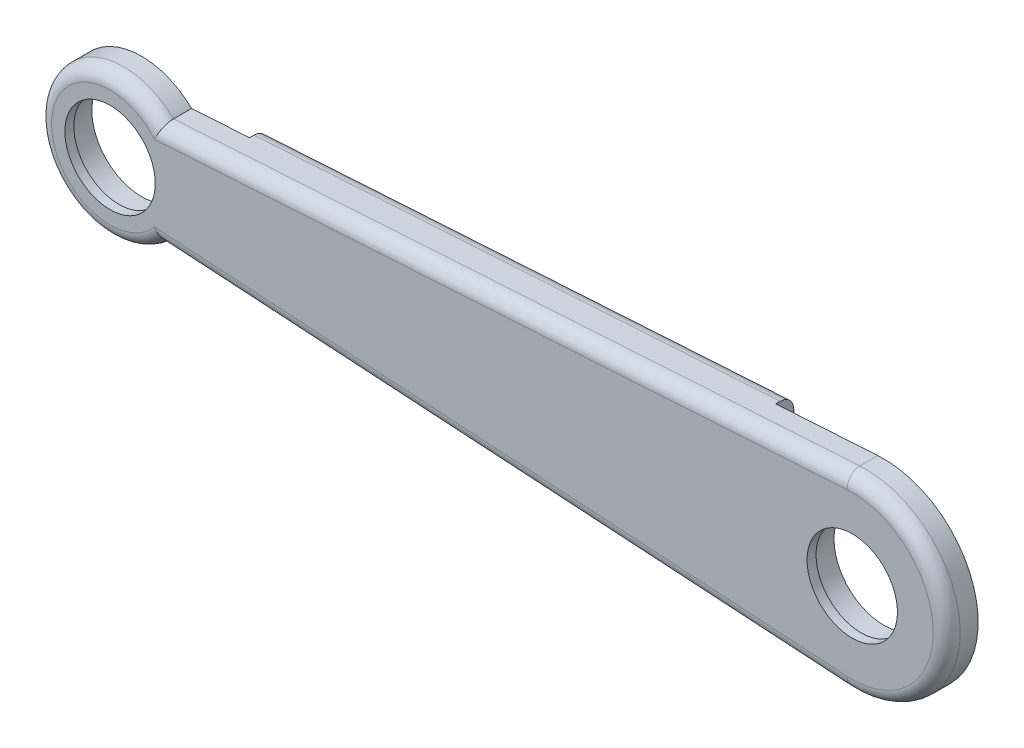
ISO-10303-21;
HEADER;
FILE_DESCRIPTION(('STEP AP214'),'2;1');
FILE_NAME('part.step','',(''),(''),'','','');
FILE_SCHEMA(('AUTOMOTIVE_DESIGN { 1 0 10303 214 1 1 1 1 }'));
ENDSEC;
DATA;
#1=APPLICATION_CONTEXT('core data for automotive mechanical design processes');
#2=APPLICATION_PROTOCOL_DEFINITION('international standard','automotive_design',2000,#1);
#3=PRODUCT_CONTEXT('',#1,'mechanical');
#4=PRODUCT('Part','Part','',(#3));
#5=PRODUCT_RELATED_PRODUCT_CATEGORY('part','',(#4));
#6=PRODUCT_DEFINITION_FORMATION('','',#4);
#7=PRODUCT_DEFINITION_CONTEXT('part definition',#1,'design');
#8=PRODUCT_DEFINITION('design','',#6,#7);
#9=PRODUCT_DEFINITION_SHAPE('','',#8);
#10=(LENGTH_UNIT() NAMED_UNIT(*) SI_UNIT(.MILLI.,.METRE.));
#11=(NAMED_UNIT(*) PLANE_ANGLE_UNIT() SI_UNIT($,.RADIAN.));
#12=(NAMED_UNIT(*) SI_UNIT($,.STERADIAN.) SOLID_ANGLE_UNIT());
#13=UNCERTAINTY_MEASURE_WITH_UNIT(LENGTH_MEASURE(1.E-05),#10,'distance_accuracy_value','');
#14=(GEOMETRIC_REPRESENTATION_CONTEXT(3) GLOBAL_UNCERTAINTY_ASSIGNED_CONTEXT((#13)) GLOBAL_UNIT_ASSIGNED_CONTEXT((#10,
#11,#12)) REPRESENTATION_CONTEXT('',''));
#15=CARTESIAN_POINT('',(0.,0.,0.));
#16=DIRECTION('',(0.,0.,1.));
#17=DIRECTION('',(1.,0.,0.));
#18=AXIS2_PLACEMENT_3D('',#15,#16,#17);
#19=CARTESIAN_POINT('',(24.,-21.01,4.));
#20=DIRECTION('',(1.,0.,0.));
#21=DIRECTION('',(0.,0.,-1.));
#22=AXIS2_PLACEMENT_3D('',#19,#20,#21);
#23=PLANE('',#22);
#24=DIRECTION('',(0.,1.,0.));
#25=VECTOR('',#24,1.);
#26=CARTESIAN_POINT('',(24.,-21.01,4.));
#27=LINE('',#26,#25);
#28=CARTESIAN_POINT('',(24.,-12.2982960509077,4.));
#29=VERTEX_POINT('',#28);
#30=CARTESIAN_POINT('',(24.,12.2982960509077,4.));
#31=VERTEX_POINT('',#30);
#32=EDGE_CURVE('E12',#29,#31,#27,.T.);
#33=ORIENTED_EDGE('',*,*,#32,.T.);
#34=DIRECTION('',(0.,0.,-1.));
#35=VECTOR('',#34,1.);
#36=CARTESIAN_POINT('',(24.,12.2982960509077,11.));
#37=LINE('',#36,#35);
#38=CARTESIAN_POINT('',(24.,12.2982960509077,3.));
#39=VERTEX_POINT('',#38);
#40=EDGE_CURVE('E397',#31,#39,#37,.T.);
#41=ORIENTED_EDGE('',*,*,#40,.T.);
#42=CARTESIAN_POINT('',(24.,9.29253554521665,3.));
#43=DIRECTION('',(1.,0.,0.));
#44=DIRECTION('',(0.,-1.,0.));
#45=AXIS2_PLACEMENT_3D('',#42,#43,#44);
#46=ELLIPSE('',#45,3.00576050569108,3.);
#47=CARTESIAN_POINT('',(24.,9.29253554521665,0.));
#48=VERTEX_POINT('',#47);
#49=EDGE_CURVE('E66',#39,#48,#46,.F.);
#50=ORIENTED_EDGE('',*,*,#49,.T.);
#51=DIRECTION('',(0.,1.,0.));
#52=VECTOR('',#51,1.);
#53=CARTESIAN_POINT('',(24.,0.,0.));
#54=LINE('',#53,#52);
#55=CARTESIAN_POINT('',(24.,-9.29253554521665,0.));
#56=VERTEX_POINT('',#55);
#57=EDGE_CURVE('E62',#56,#48,#54,.T.);
#58=ORIENTED_EDGE('',*,*,#57,.F.);
#59=CARTESIAN_POINT('',(24.,-9.29253554521665,3.));
#60=DIRECTION('',(1.,0.,0.));
#61=DIRECTION('',(0.,-1.,0.));
#62=AXIS2_PLACEMENT_3D('',#59,#60,#61);
#63=ELLIPSE('',#62,3.00576050569108,3.);
#64=CARTESIAN_POINT('',(24.,-12.2982960509077,3.));
#65=VERTEX_POINT('',#64);
#66=EDGE_CURVE('E405',#56,#65,#63,.F.);
#67=ORIENTED_EDGE('',*,*,#66,.T.);
#68=DIRECTION('',(0.,0.,-1.));
#69=VECTOR('',#68,1.);
#70=CARTESIAN_POINT('',(24.,-12.2982960509077,11.));
#71=LINE('',#70,#69);
#72=EDGE_CURVE('E48',#29,#65,#71,.T.);
#73=ORIENTED_EDGE('',*,*,#72,.F.);
#74=EDGE_LOOP('',(#33,#41,#50,#58,#67,#73));
#75=FACE_BOUND('',#74,.T.);
#76=ADVANCED_FACE('F42',(#75),#23,.F.);
#77=CARTESIAN_POINT('',(-20.0212028963718,-21.01,4.));
#78=DIRECTION('',(0.,0.,1.));
#79=DIRECTION('',(1.,0.,0.));
#80=AXIS2_PLACEMENT_3D('',#77,#78,#79);
#81=PLANE('',#80);
#82=CARTESIAN_POINT('',(0.,0.,4.));
#83=DIRECTION('',(0.,0.,1.));
#84=DIRECTION('',(1.,0.,0.));
#85=AXIS2_PLACEMENT_3D('',#82,#83,#84);
#86=CIRCLE('',#85,11.05);
#87=CARTESIAN_POINT('',(11.05,0.,4.));
#88=VERTEX_POINT('',#87);
#89=EDGE_CURVE('E402',#88,#88,#86,.T.);
#90=ORIENTED_EDGE('',*,*,#89,.T.);
#91=EDGE_LOOP('',(#90));
#92=FACE_BOUND('',#91,.T.);
#93=CARTESIAN_POINT('',(16.,0.,4.));
#94=DIRECTION('',(0.,0.,1.));
#95=DIRECTION('',(1.,0.,0.));
#96=AXIS2_PLACEMENT_3D('',#93,#94,#95);
#97=CIRCLE('',#96,2.2);
#98=CARTESIAN_POINT('',(18.2,0.,4.));
#99=VERTEX_POINT('',#98);
#100=EDGE_CURVE('E52',#99,#99,#97,.T.);
#101=ORIENTED_EDGE('',*,*,#100,.T.);
#102=EDGE_LOOP('',(#101));
#103=FACE_BOUND('',#102,.T.);
#104=CARTESIAN_POINT('',(0.,0.,4.));
#105=DIRECTION('',(0.,0.,1.));
#106=DIRECTION('',(1.,0.,0.));
#107=AXIS2_PLACEMENT_3D('',#104,#105,#106);
#108=CIRCLE('',#107,16.);
#109=CARTESIAN_POINT('',(11.1242977306435,11.5,4.));
#110=VERTEX_POINT('',#109);
#111=CARTESIAN_POINT('',(11.1242977306435,-11.5,4.));
#112=VERTEX_POINT('',#111);
#113=EDGE_CURVE('E413',#110,#112,#108,.T.);
#114=ORIENTED_EDGE('',*,*,#113,.F.);
#115=DIRECTION('',(0.998083511417436,0.0618813722911973,0.));
#116=VECTOR('',#115,1.);
#117=CARTESIAN_POINT('',(11.1242977306435,11.5,4.));
#118=LINE('',#117,#116);
#119=EDGE_CURVE('E384',#110,#31,#118,.T.);
#120=ORIENTED_EDGE('',*,*,#119,.T.);
#121=ORIENTED_EDGE('',*,*,#32,.F.);
#122=DIRECTION('',(0.998083511417436,-0.0618813722911973,0.));
#123=VECTOR('',#122,1.);
#124=CARTESIAN_POINT('',(11.1242977306435,-11.5,4.));
#125=LINE('',#124,#123);
#126=EDGE_CURVE('E420',#112,#29,#125,.T.);
#127=ORIENTED_EDGE('',*,*,#126,.F.);
#128=EDGE_LOOP('',(#114,#120,#121,#127));
#129=FACE_BOUND('',#128,.T.);
#130=ADVANCED_FACE('F353',(#92,#103,#129),#81,.F.);
#131=CARTESIAN_POINT('',(196.908753761415,-21.01,4.));
#132=DIRECTION('',(0.,0.,-1.));
#133=DIRECTION('',(-1.,0.,0.));
#134=AXIS2_PLACEMENT_3D('',#131,#132,#133);
#135=PLANE('',#134);
#136=CARTESIAN_POINT('',(165.,0.,4.));
#137=DIRECTION('',(0.,0.,-1.));
#138=DIRECTION('',(-1.,0.,0.));
#139=AXIS2_PLACEMENT_3D('',#136,#137,#138);
#140=CIRCLE('',#139,21.);
#141=CARTESIAN_POINT('',(163.700491181885,-20.9597537397661,4.00000000000001));
#142=VERTEX_POINT('',#141);
#143=CARTESIAN_POINT('',(163.700491181885,20.9597537397661,4.00000000000001));
#144=VERTEX_POINT('',#143);
#145=EDGE_CURVE('E390',#142,#144,#140,.F.);
#146=ORIENTED_EDGE('',*,*,#145,.F.);
#147=DIRECTION('',(-0.998083511417436,0.0618813722911973,0.));
#148=VECTOR('',#147,1.);
#149=CARTESIAN_POINT('',(11.1242977306435,-11.5,4.00000000000002));
#150=LINE('',#149,#148);
#151=CARTESIAN_POINT('',(141.,-19.5523188608708,4.00000000000001));
#152=VERTEX_POINT('',#151);
#153=EDGE_CURVE('E385',#142,#152,#150,.T.);
#154=ORIENTED_EDGE('',*,*,#153,.T.);
#155=DIRECTION('',(0.,1.,0.));
#156=VECTOR('',#155,1.);
#157=CARTESIAN_POINT('',(141.,-21.01,4.00000000000001));
#158=LINE('',#157,#156);
#159=CARTESIAN_POINT('',(141.,19.5523188608708,4.00000000000001));
#160=VERTEX_POINT('',#159);
#161=EDGE_CURVE('E369',#152,#160,#158,.T.);
#162=ORIENTED_EDGE('',*,*,#161,.T.);
#163=DIRECTION('',(-0.998083511417436,-0.0618813722911973,0.));
#164=VECTOR('',#163,1.);
#165=CARTESIAN_POINT('',(11.1242977306435,11.5,4.00000000000002));
#166=LINE('',#165,#164);
#167=EDGE_CURVE('E400',#144,#160,#166,.T.);
#168=ORIENTED_EDGE('',*,*,#167,.F.);
#169=EDGE_LOOP('',(#146,#154,#162,#168));
#170=FACE_BOUND('',#169,.T.);
#171=CARTESIAN_POINT('',(165.,0.,4.));
#172=DIRECTION('',(0.,0.,-1.));
#173=DIRECTION('',(-1.,0.,0.));
#174=AXIS2_PLACEMENT_3D('',#171,#172,#173);
#175=CIRCLE('',#174,11.05);
#176=CARTESIAN_POINT('',(153.95,0.,4.00000000000001));
#177=VERTEX_POINT('',#176);
#178=EDGE_CURVE('E401',#177,#177,#175,.F.);
#179=ORIENTED_EDGE('',*,*,#178,.T.);
#180=EDGE_LOOP('',(#179));
#181=FACE_BOUND('',#180,.T.);
#182=CARTESIAN_POINT('',(149.,0.,4.));
#183=DIRECTION('',(0.,0.,-1.));
#184=DIRECTION('',(-1.,0.,0.));
#185=AXIS2_PLACEMENT_3D('',#182,#183,#184);
#186=CIRCLE('',#185,2.19999999999998);
#187=CARTESIAN_POINT('',(146.8,0.,4.));
#188=VERTEX_POINT('',#187);
#189=EDGE_CURVE('E533',#188,#188,#186,.T.);
#190=ORIENTED_EDGE('',*,*,#189,.F.);
#191=EDGE_LOOP('',(#190));
#192=FACE_BOUND('',#191,.T.);
#193=ADVANCED_FACE('F46',(#170,#181,#192),#135,.T.);
#194=CARTESIAN_POINT('',(141.,-21.01,4.00000000000001));
#195=DIRECTION('',(1.,0.,0.));
#196=DIRECTION('',(0.,0.,-1.));
#197=AXIS2_PLACEMENT_3D('',#194,#195,#196);
#198=PLANE('',#197);
#199=ORIENTED_EDGE('',*,*,#161,.F.);
#200=DIRECTION('',(0.,0.,-1.));
#201=VECTOR('',#200,1.);
#202=CARTESIAN_POINT('',(141.,-19.5523188608708,11.));
#203=LINE('',#202,#201);
#204=CARTESIAN_POINT('',(141.,-19.5523188608708,3.));
#205=VERTEX_POINT('',#204);
#206=EDGE_CURVE('E375',#152,#205,#203,.T.);
#207=ORIENTED_EDGE('',*,*,#206,.T.);
#208=CARTESIAN_POINT('',(141.,-16.5465583551797,3.));
#209=DIRECTION('',(1.,0.,0.));
#210=DIRECTION('',(0.,-1.,0.));
#211=AXIS2_PLACEMENT_3D('',#208,#209,#210);
#212=ELLIPSE('',#211,3.00576050569108,3.);
#213=CARTESIAN_POINT('',(141.,-16.5465583551797,0.));
#214=VERTEX_POINT('',#213);
#215=EDGE_CURVE('E396',#214,#205,#212,.F.);
#216=ORIENTED_EDGE('',*,*,#215,.F.);
#217=DIRECTION('',(0.,1.,0.));
#218=VECTOR('',#217,1.);
#219=CARTESIAN_POINT('',(141.,0.,0.));
#220=LINE('',#219,#218);
#221=CARTESIAN_POINT('',(141.,16.5465583551797,0.));
#222=VERTEX_POINT('',#221);
#223=EDGE_CURVE('E386',#214,#222,#220,.T.);
#224=ORIENTED_EDGE('',*,*,#223,.T.);
#225=CARTESIAN_POINT('',(141.,16.5465583551797,3.));
#226=DIRECTION('',(1.,0.,0.));
#227=DIRECTION('',(0.,-1.,0.));
#228=AXIS2_PLACEMENT_3D('',#225,#226,#227);
#229=ELLIPSE('',#228,3.00576050569108,3.);
#230=CARTESIAN_POINT('',(141.,19.5523188608708,3.));
#231=VERTEX_POINT('',#230);
#232=EDGE_CURVE('E290',#231,#222,#229,.F.);
#233=ORIENTED_EDGE('',*,*,#232,.F.);
#234=DIRECTION('',(0.,0.,-1.));
#235=VECTOR('',#234,1.);
#236=CARTESIAN_POINT('',(141.,19.5523188608708,11.));
#237=LINE('',#236,#235);
#238=EDGE_CURVE('E371',#160,#231,#237,.T.);
#239=ORIENTED_EDGE('',*,*,#238,.F.);
#240=EDGE_LOOP('',(#199,#207,#216,#224,#233,#239));
#241=FACE_BOUND('',#240,.T.);
#242=ADVANCED_FACE('F326',(#241),#198,.T.);
#243=CARTESIAN_POINT('',(149.,0.,10.));
#244=DIRECTION('',(0.,0.,-1.));
#245=DIRECTION('',(-1.,0.,0.));
#246=AXIS2_PLACEMENT_3D('',#243,#244,#245);
#247=PLANE('',#246);
#248=CARTESIAN_POINT('',(149.,0.,10.));
#249=DIRECTION('',(0.,0.,-1.));
#250=DIRECTION('',(-1.,0.,0.));
#251=AXIS2_PLACEMENT_3D('',#248,#249,#250);
#252=CIRCLE('',#251,2.19999999999998);
#253=CARTESIAN_POINT('',(146.8,0.,10.));
#254=VERTEX_POINT('',#253);
#255=EDGE_CURVE('E203',#254,#254,#252,.T.);
#256=ORIENTED_EDGE('',*,*,#255,.T.);
#257=EDGE_LOOP('',(#256));
#258=FACE_BOUND('',#257,.T.);
#259=ADVANCED_FACE('F356',(#258),#247,.T.);
#260=CARTESIAN_POINT('',(149.,0.,10.));
#261=DIRECTION('',(0.,0.,-1.));
#262=DIRECTION('',(-1.,0.,0.));
#263=AXIS2_PLACEMENT_3D('',#260,#261,#262);
#264=CYLINDRICAL_SURFACE('',#263,2.19999999999998);
#265=ORIENTED_EDGE('',*,*,#255,.F.);
#266=EDGE_LOOP('',(#265));
#267=FACE_BOUND('',#266,.T.);
#268=ORIENTED_EDGE('',*,*,#189,.T.);
#269=EDGE_LOOP('',(#268));
#270=FACE_BOUND('',#269,.T.);
#271=ADVANCED_FACE('F363',(#267,#270),#264,.F.);
#272=CARTESIAN_POINT('',(0.,0.,0.));
#273=DIRECTION('',(0.,0.,1.));
#274=DIRECTION('',(1.,0.,0.));
#275=AXIS2_PLACEMENT_3D('',#272,#273,#274);
#276=PLANE('',#275);
#277=ORIENTED_EDGE('',*,*,#223,.F.);
#278=DIRECTION('',(0.998083511417436,-0.0618813722911973,0.));
#279=VECTOR('',#278,1.);
#280=CARTESIAN_POINT('',(-0.48202950219566,-7.77464494313874,0.));
#281=LINE('',#280,#279);
#282=CARTESIAN_POINT('',(122.608915679571,-15.4063075418434,0.));
#283=VERTEX_POINT('',#282);
#284=EDGE_CURVE('E273',#214,#283,#281,.F.);
#285=ORIENTED_EDGE('',*,*,#284,.T.);
#286=CARTESIAN_POINT('',(123.564109750732,0.,0.));
#287=DIRECTION('',(0.,0.,1.));
#288=DIRECTION('',(1.,0.,0.));
#289=AXIS2_PLACEMENT_3D('',#286,#287,#288);
#290=CIRCLE('',#289,15.4358902492679);
#291=CARTESIAN_POINT('',(122.608915679571,15.4063075418434,0.));
#292=VERTEX_POINT('',#291);
#293=EDGE_CURVE('E277',#283,#292,#290,.T.);
#294=ORIENTED_EDGE('',*,*,#293,.T.);
#295=DIRECTION('',(0.998083511417436,0.0618813722911973,0.));
#296=VECTOR('',#295,1.);
#297=CARTESIAN_POINT('',(163.886135298759,17.9655032055138,0.));
#298=LINE('',#297,#296);
#299=EDGE_CURVE('E274',#292,#222,#298,.T.);
#300=ORIENTED_EDGE('',*,*,#299,.T.);
#301=EDGE_LOOP('',(#277,#285,#294,#300));
#302=FACE_BOUND('',#301,.T.);
#303=ADVANCED_FACE('F435',(#302),#276,.F.);
#304=CARTESIAN_POINT('',(11.1242977306435,-11.5,11.));
#305=DIRECTION('',(0.0618813722911973,0.998083511417436,0.));
#306=DIRECTION('',(-0.998083511417436,0.0618813722911973,0.));
#307=AXIS2_PLACEMENT_3D('',#304,#305,#306);
#308=PLANE('',#307);
#309=DIRECTION('',(0.,0.,-1.));
#310=VECTOR('',#309,1.);
#311=CARTESIAN_POINT('',(11.1242977306435,-11.5,11.));
#312=LINE('',#311,#310);
#313=CARTESIAN_POINT('',(11.1242977306435,-11.5,8.));
#314=VERTEX_POINT('',#313);
#315=EDGE_CURVE('E240',#314,#112,#312,.T.);
#316=ORIENTED_EDGE('',*,*,#315,.T.);
#317=ORIENTED_EDGE('',*,*,#126,.T.);
#318=ORIENTED_EDGE('',*,*,#72,.T.);
#319=DIRECTION('',(0.998083511417436,-0.0618813722911973,0.));
#320=VECTOR('',#319,1.);
#321=CARTESIAN_POINT('',(11.1242977306435,-11.5,3.));
#322=LINE('',#321,#320);
#323=EDGE_CURVE('E251',#65,#205,#322,.T.);
#324=ORIENTED_EDGE('',*,*,#323,.T.);
#325=ORIENTED_EDGE('',*,*,#206,.F.);
#326=ORIENTED_EDGE('',*,*,#153,.F.);
#327=DIRECTION('',(0.,0.,-1.));
#328=VECTOR('',#327,1.);
#329=CARTESIAN_POINT('',(163.700491181885,-20.9597537397661,11.));
#330=LINE('',#329,#328);
#331=CARTESIAN_POINT('',(163.700491181885,-20.9597537397661,8.));
#332=VERTEX_POINT('',#331);
#333=EDGE_CURVE('E233',#332,#142,#330,.T.);
#334=ORIENTED_EDGE('',*,*,#333,.F.);
#335=DIRECTION('',(0.998083511417436,-0.0618813722911973,0.));
#336=VECTOR('',#335,1.);
#337=CARTESIAN_POINT('',(11.1242977306435,-11.5,8.));
#338=LINE('',#337,#336);
#339=EDGE_CURVE('E257',#332,#314,#338,.F.);
#340=ORIENTED_EDGE('',*,*,#339,.T.);
#341=EDGE_LOOP('',(#316,#317,#318,#324,#325,#326,#334,#340));
#342=FACE_BOUND('',#341,.T.);
#343=ADVANCED_FACE('F378',(#342),#308,.F.);
#344=CARTESIAN_POINT('',(165.,0.,11.));
#345=DIRECTION('',(0.,0.,-1.));
#346=DIRECTION('',(-1.,0.,0.));
#347=AXIS2_PLACEMENT_3D('',#344,#345,#346);
#348=CYLINDRICAL_SURFACE('',#347,21.);
#349=ORIENTED_EDGE('',*,*,#145,.T.);
#350=DIRECTION('',(0.,0.,-1.));
#351=VECTOR('',#350,1.);
#352=CARTESIAN_POINT('',(163.700491181885,20.9597537397661,11.));
#353=LINE('',#352,#351);
#354=CARTESIAN_POINT('',(163.700491181885,20.9597537397661,8.));
#355=VERTEX_POINT('',#354);
#356=EDGE_CURVE('E231',#355,#144,#353,.T.);
#357=ORIENTED_EDGE('',*,*,#356,.F.);
#358=CARTESIAN_POINT('',(165.,0.,8.));
#359=DIRECTION('',(0.,0.,1.));
#360=DIRECTION('',(1.,0.,0.));
#361=AXIS2_PLACEMENT_3D('',#358,#359,#360);
#362=CIRCLE('',#361,21.);
#363=EDGE_CURVE('E260',#355,#332,#362,.F.);
#364=ORIENTED_EDGE('',*,*,#363,.T.);
#365=ORIENTED_EDGE('',*,*,#333,.T.);
#366=EDGE_LOOP('',(#349,#357,#364,#365));
#367=FACE_BOUND('',#366,.T.);
#368=ADVANCED_FACE('F473',(#367),#348,.T.);
#369=CARTESIAN_POINT('',(11.1242977306435,11.5,11.));
#370=DIRECTION('',(-0.0618813722911973,0.998083511417436,0.));
#371=DIRECTION('',(-0.998083511417436,-0.0618813722911973,0.));
#372=AXIS2_PLACEMENT_3D('',#369,#370,#371);
#373=PLANE('',#372);
#374=ORIENTED_EDGE('',*,*,#119,.F.);
#375=DIRECTION('',(0.,0.,-1.));
#376=VECTOR('',#375,1.);
#377=CARTESIAN_POINT('',(11.1242977306435,11.5,11.));
#378=LINE('',#377,#376);
#379=CARTESIAN_POINT('',(11.1242977306435,11.5,8.));
#380=VERTEX_POINT('',#379);
#381=EDGE_CURVE('E224',#380,#110,#378,.T.);
#382=ORIENTED_EDGE('',*,*,#381,.F.);
#383=DIRECTION('',(0.998083511417436,0.0618813722911973,0.));
#384=VECTOR('',#383,1.);
#385=CARTESIAN_POINT('',(11.1242977306435,11.5,8.));
#386=LINE('',#385,#384);
#387=EDGE_CURVE('E264',#380,#355,#386,.T.);
#388=ORIENTED_EDGE('',*,*,#387,.T.);
#389=ORIENTED_EDGE('',*,*,#356,.T.);
#390=ORIENTED_EDGE('',*,*,#167,.T.);
#391=ORIENTED_EDGE('',*,*,#238,.T.);
#392=DIRECTION('',(0.998083511417436,0.0618813722911973,0.));
#393=VECTOR('',#392,1.);
#394=CARTESIAN_POINT('',(11.1242977306435,11.5,3.));
#395=LINE('',#394,#393);
#396=EDGE_CURVE('E263',#231,#39,#395,.F.);
#397=ORIENTED_EDGE('',*,*,#396,.T.);
#398=ORIENTED_EDGE('',*,*,#40,.F.);
#399=EDGE_LOOP('',(#374,#382,#388,#389,#390,#391,#397,#398));
#400=FACE_BOUND('',#399,.T.);
#401=ADVANCED_FACE('F427',(#400),#373,.T.);
#402=CARTESIAN_POINT('',(165.,0.,42.2541197284454));
#403=DIRECTION('',(0.,0.,-1.));
#404=DIRECTION('',(-1.,0.,0.));
#405=AXIS2_PLACEMENT_3D('',#402,#403,#404);
#406=CYLINDRICAL_SURFACE('',#405,11.05);
#407=CARTESIAN_POINT('',(165.,0.,9.));
#408=DIRECTION('',(0.,0.,1.));
#409=DIRECTION('',(1.,0.,0.));
#410=AXIS2_PLACEMENT_3D('',#407,#408,#409);
#411=CIRCLE('',#410,11.05);
#412=CARTESIAN_POINT('',(176.05,0.,9.));
#413=VERTEX_POINT('',#412);
#414=EDGE_CURVE('E226',#413,#413,#411,.F.);
#415=ORIENTED_EDGE('',*,*,#414,.F.);
#416=EDGE_LOOP('',(#415));
#417=FACE_BOUND('',#416,.T.);
#418=ORIENTED_EDGE('',*,*,#178,.F.);
#419=EDGE_LOOP('',(#418));
#420=FACE_BOUND('',#419,.T.);
#421=ADVANCED_FACE('F347',(#417,#420),#406,.F.);
#422=CARTESIAN_POINT('',(11.3099418475171,-8.50574946574769,3.));
#423=DIRECTION('',(0.998083511417436,-0.0618813722911973,0.));
#424=DIRECTION('',(0.0618813722911973,0.998083511417436,0.));
#425=AXIS2_PLACEMENT_3D('',#422,#423,#424);
#426=CYLINDRICAL_SURFACE('',#425,3.);
#427=ORIENTED_EDGE('',*,*,#66,.F.);
#428=DIRECTION('',(0.998083511417436,-0.0618813722911973,0.));
#429=VECTOR('',#428,1.);
#430=CARTESIAN_POINT('',(-0.48202950219566,-7.77464494313874,0.));
#431=LINE('',#430,#429);
#432=CARTESIAN_POINT('',(35.3984892515236,-9.99924410102581,0.));
#433=VERTEX_POINT('',#432);
#434=EDGE_CURVE('E266',#433,#56,#431,.F.);
#435=ORIENTED_EDGE('',*,*,#434,.F.);
#436=DIRECTION('',(0.998083511417436,-0.0618813722911973,0.));
#437=VECTOR('',#436,1.);
#438=CARTESIAN_POINT('',(-0.48202950219566,-7.77464494313874,0.));
#439=LINE('',#438,#437);
#440=EDGE_CURVE('E448',#283,#433,#439,.F.);
#441=ORIENTED_EDGE('',*,*,#440,.F.);
#442=ORIENTED_EDGE('',*,*,#284,.F.);
#443=ORIENTED_EDGE('',*,*,#215,.T.);
#444=ORIENTED_EDGE('',*,*,#323,.F.);
#445=EDGE_LOOP('',(#427,#435,#441,#442,#443,#444));
#446=FACE_BOUND('',#445,.T.);
#447=ADVANCED_FACE('F341',(#446),#426,.T.);
#448=CARTESIAN_POINT('',(-0.48202950219566,7.77464494313875,3.));
#449=DIRECTION('',(-0.998083511417436,-0.0618813722911973,0.));
#450=DIRECTION('',(0.0618813722911973,-0.998083511417436,0.));
#451=AXIS2_PLACEMENT_3D('',#448,#449,#450);
#452=CYLINDRICAL_SURFACE('',#451,3.);
#453=ORIENTED_EDGE('',*,*,#49,.F.);
#454=ORIENTED_EDGE('',*,*,#396,.F.);
#455=ORIENTED_EDGE('',*,*,#232,.T.);
#456=ORIENTED_EDGE('',*,*,#299,.F.);
#457=DIRECTION('',(0.998083511417436,0.0618813722911973,0.));
#458=VECTOR('',#457,1.);
#459=CARTESIAN_POINT('',(163.886135298759,17.9655032055138,0.));
#460=LINE('',#459,#458);
#461=CARTESIAN_POINT('',(35.3984892515236,9.99924410102581,0.));
#462=VERTEX_POINT('',#461);
#463=EDGE_CURVE('E442',#462,#292,#460,.T.);
#464=ORIENTED_EDGE('',*,*,#463,.F.);
#465=DIRECTION('',(0.998083511417436,0.0618813722911973,0.));
#466=VECTOR('',#465,1.);
#467=CARTESIAN_POINT('',(163.886135298759,17.9655032055138,0.));
#468=LINE('',#467,#466);
#469=EDGE_CURVE('E271',#48,#462,#468,.T.);
#470=ORIENTED_EDGE('',*,*,#469,.F.);
#471=EDGE_LOOP('',(#453,#454,#455,#456,#464,#470));
#472=FACE_BOUND('',#471,.T.);
#473=ADVANCED_FACE('F338',(#472),#452,.T.);
#474=ORIENTED_EDGE('',*,*,#434,.T.);
#475=ORIENTED_EDGE('',*,*,#57,.T.);
#476=ORIENTED_EDGE('',*,*,#469,.T.);
#477=CARTESIAN_POINT('',(36.0184443352093,0.,0.));
#478=DIRECTION('',(0.,0.,1.));
#479=DIRECTION('',(1.,0.,0.));
#480=AXIS2_PLACEMENT_3D('',#477,#478,#479);
#481=CIRCLE('',#480,10.0184443352093);
#482=EDGE_CURVE('E268',#462,#433,#481,.T.);
#483=ORIENTED_EDGE('',*,*,#482,.T.);
#484=EDGE_LOOP('',(#474,#475,#476,#483));
#485=FACE_BOUND('',#484,.T.);
#486=ADVANCED_FACE('F345',(#485),#276,.F.);
#487=CARTESIAN_POINT('',(0.,0.,11.));
#488=DIRECTION('',(0.,0.,1.));
#489=DIRECTION('',(1.,0.,0.));
#490=AXIS2_PLACEMENT_3D('',#487,#488,#489);
#491=PLANE('',#490);
#492=DIRECTION('',(0.998083511417436,0.0618813722911973,0.));
#493=VECTOR('',#492,1.);
#494=CARTESIAN_POINT('',(-0.48202950219566,7.77464494313874,11.));
#495=LINE('',#494,#493);
#496=CARTESIAN_POINT('',(163.886135298758,17.9655032055138,11.));
#497=VERTEX_POINT('',#496);
#498=CARTESIAN_POINT('',(9.90583570640879,8.41869461125873,11.));
#499=VERTEX_POINT('',#498);
#500=EDGE_CURVE('E238',#497,#499,#495,.F.);
#501=ORIENTED_EDGE('',*,*,#500,.T.);
#502=CARTESIAN_POINT('',(0.,0.,11.));
#503=DIRECTION('',(0.,0.,1.));
#504=DIRECTION('',(1.,0.,0.));
#505=AXIS2_PLACEMENT_3D('',#502,#503,#504);
#506=CIRCLE('',#505,13.);
#507=CARTESIAN_POINT('',(9.90583570640879,-8.41869461125873,11.));
#508=VERTEX_POINT('',#507);
#509=EDGE_CURVE('E246',#499,#508,#506,.T.);
#510=ORIENTED_EDGE('',*,*,#509,.T.);
#511=DIRECTION('',(0.998083511417436,-0.0618813722911973,0.));
#512=VECTOR('',#511,1.);
#513=CARTESIAN_POINT('',(163.886135298759,-17.9655032055138,11.));
#514=LINE('',#513,#512);
#515=CARTESIAN_POINT('',(163.886135298758,-17.9655032055138,11.));
#516=VERTEX_POINT('',#515);
#517=EDGE_CURVE('E247',#508,#516,#514,.T.);
#518=ORIENTED_EDGE('',*,*,#517,.T.);
#519=CARTESIAN_POINT('',(165.,0.,11.));
#520=DIRECTION('',(0.,0.,1.));
#521=DIRECTION('',(1.,0.,0.));
#522=AXIS2_PLACEMENT_3D('',#519,#520,#521);
#523=CIRCLE('',#522,18.);
#524=EDGE_CURVE('E241',#516,#497,#523,.T.);
#525=ORIENTED_EDGE('',*,*,#524,.T.);
#526=EDGE_LOOP('',(#501,#510,#518,#525));
#527=FACE_BOUND('',#526,.T.);
#528=CARTESIAN_POINT('',(0.,0.,11.));
#529=DIRECTION('',(0.,0.,1.));
#530=DIRECTION('',(1.,0.,0.));
#531=AXIS2_PLACEMENT_3D('',#528,#529,#530);
#532=CIRCLE('',#531,10.05);
#533=CARTESIAN_POINT('',(10.05,0.,11.));
#534=VERTEX_POINT('',#533);
#535=EDGE_CURVE('E199',#534,#534,#532,.T.);
#536=ORIENTED_EDGE('',*,*,#535,.F.);
#537=EDGE_LOOP('',(#536));
#538=FACE_BOUND('',#537,.T.);
#539=CARTESIAN_POINT('',(165.,0.,11.));
#540=DIRECTION('',(0.,0.,-1.));
#541=DIRECTION('',(-1.,0.,0.));
#542=AXIS2_PLACEMENT_3D('',#539,#540,#541);
#543=CIRCLE('',#542,10.05);
#544=CARTESIAN_POINT('',(154.95,0.,11.));
#545=VERTEX_POINT('',#544);
#546=EDGE_CURVE('E202',#545,#545,#543,.T.);
#547=ORIENTED_EDGE('',*,*,#546,.T.);
#548=EDGE_LOOP('',(#547));
#549=FACE_BOUND('',#548,.T.);
#550=ADVANCED_FACE('F462',(#527,#538,#549),#491,.T.);
#551=CARTESIAN_POINT('',(0.,0.,11.));
#552=DIRECTION('',(0.,0.,-1.));
#553=DIRECTION('',(-1.,0.,0.));
#554=AXIS2_PLACEMENT_3D('',#551,#552,#553);
#555=CYLINDRICAL_SURFACE('',#554,16.);
#556=ORIENTED_EDGE('',*,*,#381,.T.);
#557=ORIENTED_EDGE('',*,*,#113,.T.);
#558=ORIENTED_EDGE('',*,*,#315,.F.);
#559=CARTESIAN_POINT('',(0.,0.,8.));
#560=DIRECTION('',(0.,0.,1.));
#561=DIRECTION('',(1.,0.,0.));
#562=AXIS2_PLACEMENT_3D('',#559,#560,#561);
#563=CIRCLE('',#562,16.);
#564=EDGE_CURVE('E252',#314,#380,#563,.F.);
#565=ORIENTED_EDGE('',*,*,#564,.T.);
#566=EDGE_LOOP('',(#556,#557,#558,#565));
#567=FACE_BOUND('',#566,.T.);
#568=ADVANCED_FACE('F469',(#567),#555,.T.);
#569=CARTESIAN_POINT('',(165.,0.,11.));
#570=DIRECTION('',(0.,0.,-1.));
#571=DIRECTION('',(-1.,0.,0.));
#572=AXIS2_PLACEMENT_3D('',#569,#570,#571);
#573=CYLINDRICAL_SURFACE('',#572,10.05);
#574=ORIENTED_EDGE('',*,*,#546,.F.);
#575=EDGE_LOOP('',(#574));
#576=FACE_BOUND('',#575,.T.);
#577=CARTESIAN_POINT('',(165.,0.,9.));
#578=DIRECTION('',(0.,0.,1.));
#579=DIRECTION('',(1.,0.,0.));
#580=AXIS2_PLACEMENT_3D('',#577,#578,#579);
#581=CIRCLE('',#580,10.05);
#582=CARTESIAN_POINT('',(175.05,0.,9.));
#583=VERTEX_POINT('',#582);
#584=EDGE_CURVE('E220',#583,#583,#581,.T.);
#585=ORIENTED_EDGE('',*,*,#584,.F.);
#586=EDGE_LOOP('',(#585));
#587=FACE_BOUND('',#586,.T.);
#588=ADVANCED_FACE('F501',(#576,#587),#573,.F.);
#589=CARTESIAN_POINT('',(0.,0.,11.));
#590=DIRECTION('',(0.,0.,-1.));
#591=DIRECTION('',(-1.,0.,0.));
#592=AXIS2_PLACEMENT_3D('',#589,#590,#591);
#593=CYLINDRICAL_SURFACE('',#592,10.05);
#594=ORIENTED_EDGE('',*,*,#535,.T.);
#595=EDGE_LOOP('',(#594));
#596=FACE_BOUND('',#595,.T.);
#597=CARTESIAN_POINT('',(0.,0.,9.));
#598=DIRECTION('',(0.,0.,1.));
#599=DIRECTION('',(1.,0.,0.));
#600=AXIS2_PLACEMENT_3D('',#597,#598,#599);
#601=CIRCLE('',#600,10.05);
#602=CARTESIAN_POINT('',(10.05,0.,9.));
#603=VERTEX_POINT('',#602);
#604=EDGE_CURVE('E221',#603,#603,#601,.F.);
#605=ORIENTED_EDGE('',*,*,#604,.T.);
#606=EDGE_LOOP('',(#605));
#607=FACE_BOUND('',#606,.T.);
#608=ADVANCED_FACE('F503',(#596,#607),#593,.F.);
#609=CARTESIAN_POINT('',(0.,0.,9.));
#610=DIRECTION('',(0.,0.,1.));
#611=DIRECTION('',(1.,0.,0.));
#612=AXIS2_PLACEMENT_3D('',#609,#610,#611);
#613=PLANE('',#612);
#614=ORIENTED_EDGE('',*,*,#584,.T.);
#615=EDGE_LOOP('',(#614));
#616=FACE_BOUND('',#615,.T.);
#617=ORIENTED_EDGE('',*,*,#414,.T.);
#618=EDGE_LOOP('',(#617));
#619=FACE_BOUND('',#618,.T.);
#620=ADVANCED_FACE('F509',(#616,#619),#613,.F.);
#621=CARTESIAN_POINT('',(0.,0.,42.2541197284454));
#622=DIRECTION('',(0.,0.,-1.));
#623=DIRECTION('',(-1.,0.,0.));
#624=AXIS2_PLACEMENT_3D('',#621,#622,#623);
#625=CYLINDRICAL_SURFACE('',#624,11.05);
#626=ORIENTED_EDGE('',*,*,#89,.F.);
#627=EDGE_LOOP('',(#626));
#628=FACE_BOUND('',#627,.T.);
#629=CARTESIAN_POINT('',(0.,0.,9.));
#630=DIRECTION('',(0.,0.,1.));
#631=DIRECTION('',(1.,0.,0.));
#632=AXIS2_PLACEMENT_3D('',#629,#630,#631);
#633=CIRCLE('',#632,11.05);
#634=CARTESIAN_POINT('',(11.05,0.,9.));
#635=VERTEX_POINT('',#634);
#636=EDGE_CURVE('E225',#635,#635,#633,.T.);
#637=ORIENTED_EDGE('',*,*,#636,.T.);
#638=EDGE_LOOP('',(#637));
#639=FACE_BOUND('',#638,.T.);
#640=ADVANCED_FACE('F508',(#628,#639),#625,.F.);
#641=CARTESIAN_POINT('',(0.,0.,9.));
#642=DIRECTION('',(0.,0.,1.));
#643=DIRECTION('',(1.,0.,0.));
#644=AXIS2_PLACEMENT_3D('',#641,#642,#643);
#645=PLANE('',#644);
#646=ORIENTED_EDGE('',*,*,#604,.F.);
#647=EDGE_LOOP('',(#646));
#648=FACE_BOUND('',#647,.T.);
#649=ORIENTED_EDGE('',*,*,#636,.F.);
#650=EDGE_LOOP('',(#649));
#651=FACE_BOUND('',#650,.T.);
#652=ADVANCED_FACE('F500',(#648,#651),#645,.F.);
#653=CARTESIAN_POINT('',(36.0184443352093,0.,120.852653427978));
#654=DIRECTION('',(0.,0.,-1.));
#655=DIRECTION('',(-1.,0.,0.));
#656=AXIS2_PLACEMENT_3D('',#653,#654,#655);
#657=CYLINDRICAL_SURFACE('',#656,7.01844433520929);
#658=DIRECTION('',(0.,0.,-1.));
#659=VECTOR('',#658,1.);
#660=CARTESIAN_POINT('',(35.5841333683972,-7.0049935667735,120.852653427978));
#661=LINE('',#660,#659);
#662=CARTESIAN_POINT('',(35.5841333683972,-7.0049935667735,8.00000000000001));
#663=VERTEX_POINT('',#662);
#664=CARTESIAN_POINT('',(35.5841333683972,-7.0049935667735,3.));
#665=VERTEX_POINT('',#664);
#666=EDGE_CURVE('E206',#663,#665,#661,.T.);
#667=ORIENTED_EDGE('',*,*,#666,.T.);
#668=CARTESIAN_POINT('',(36.0184443352093,0.,3.));
#669=DIRECTION('',(0.,0.,1.));
#670=DIRECTION('',(1.,0.,0.));
#671=AXIS2_PLACEMENT_3D('',#668,#669,#670);
#672=CIRCLE('',#671,7.01844433520929);
#673=CARTESIAN_POINT('',(35.5841333683972,7.0049935667735,3.));
#674=VERTEX_POINT('',#673);
#675=EDGE_CURVE('E283',#665,#674,#672,.F.);
#676=ORIENTED_EDGE('',*,*,#675,.T.);
#677=DIRECTION('',(0.,0.,-1.));
#678=VECTOR('',#677,1.);
#679=CARTESIAN_POINT('',(35.5841333683972,7.0049935667735,120.852653427978));
#680=LINE('',#679,#678);
#681=CARTESIAN_POINT('',(35.5841333683972,7.0049935667735,8.00000000000001));
#682=VERTEX_POINT('',#681);
#683=EDGE_CURVE('E212',#682,#674,#680,.T.);
#684=ORIENTED_EDGE('',*,*,#683,.F.);
#685=CARTESIAN_POINT('',(36.0184443352093,0.,8.00000000000001));
#686=DIRECTION('',(0.,0.,1.));
#687=DIRECTION('',(1.,0.,0.));
#688=AXIS2_PLACEMENT_3D('',#685,#686,#687);
#689=CIRCLE('',#688,7.01844433520929);
#690=EDGE_CURVE('E195',#682,#663,#689,.T.);
#691=ORIENTED_EDGE('',*,*,#690,.T.);
#692=EDGE_LOOP('',(#667,#676,#684,#691));
#693=FACE_BOUND('',#692,.T.);
#694=ADVANCED_FACE('F493',(#693),#657,.F.);
#695=CARTESIAN_POINT('',(35.5841333683972,-7.0049935667735,120.852653427978));
#696=DIRECTION('',(0.0618813722911974,0.998083511417436,0.));
#697=DIRECTION('',(-0.998083511417436,0.0618813722911974,0.));
#698=AXIS2_PLACEMENT_3D('',#695,#696,#697);
#699=PLANE('',#698);
#700=DIRECTION('',(0.,0.,-1.));
#701=VECTOR('',#700,1.);
#702=CARTESIAN_POINT('',(122.794559796445,-12.4120570075911,120.852653427978));
#703=LINE('',#702,#701);
#704=CARTESIAN_POINT('',(122.794559796445,-12.4120570075911,8.00000000000001));
#705=VERTEX_POINT('',#704);
#706=CARTESIAN_POINT('',(122.794559796445,-12.4120570075911,3.));
#707=VERTEX_POINT('',#706);
#708=EDGE_CURVE('E182',#705,#707,#703,.T.);
#709=ORIENTED_EDGE('',*,*,#708,.T.);
#710=DIRECTION('',(0.998083511417436,-0.0618813722911974,0.));
#711=VECTOR('',#710,1.);
#712=CARTESIAN_POINT('',(35.5841333683972,-7.0049935667735,3.));
#713=LINE('',#712,#711);
#714=EDGE_CURVE('E284',#707,#665,#713,.F.);
#715=ORIENTED_EDGE('',*,*,#714,.T.);
#716=ORIENTED_EDGE('',*,*,#666,.F.);
#717=DIRECTION('',(0.998083511417436,-0.0618813722911974,0.));
#718=VECTOR('',#717,1.);
#719=CARTESIAN_POINT('',(35.5841333683972,-7.0049935667735,8.00000000000001));
#720=LINE('',#719,#718);
#721=EDGE_CURVE('E200',#663,#705,#720,.T.);
#722=ORIENTED_EDGE('',*,*,#721,.T.);
#723=EDGE_LOOP('',(#709,#715,#716,#722));
#724=FACE_BOUND('',#723,.T.);
#725=ADVANCED_FACE('F487',(#724),#699,.T.);
#726=CARTESIAN_POINT('',(123.564109750732,0.,120.852653427978));
#727=DIRECTION('',(0.,0.,-1.));
#728=DIRECTION('',(-1.,0.,0.));
#729=AXIS2_PLACEMENT_3D('',#726,#727,#728);
#730=CYLINDRICAL_SURFACE('',#729,12.4358902492679);
#731=DIRECTION('',(0.,0.,-1.));
#732=VECTOR('',#731,1.);
#733=CARTESIAN_POINT('',(122.794559796445,12.4120570075911,120.852653427978));
#734=LINE('',#733,#732);
#735=CARTESIAN_POINT('',(122.794559796445,12.4120570075911,8.00000000000001));
#736=VERTEX_POINT('',#735);
#737=CARTESIAN_POINT('',(122.794559796445,12.4120570075911,3.));
#738=VERTEX_POINT('',#737);
#739=EDGE_CURVE('E171',#736,#738,#734,.T.);
#740=ORIENTED_EDGE('',*,*,#739,.T.);
#741=CARTESIAN_POINT('',(123.564109750732,0.,3.));
#742=DIRECTION('',(0.,0.,1.));
#743=DIRECTION('',(1.,0.,0.));
#744=AXIS2_PLACEMENT_3D('',#741,#742,#743);
#745=CIRCLE('',#744,12.4358902492679);
#746=EDGE_CURVE('E282',#738,#707,#745,.F.);
#747=ORIENTED_EDGE('',*,*,#746,.T.);
#748=ORIENTED_EDGE('',*,*,#708,.F.);
#749=CARTESIAN_POINT('',(123.564109750732,0.,8.00000000000001));
#750=DIRECTION('',(0.,0.,1.));
#751=DIRECTION('',(1.,0.,0.));
#752=AXIS2_PLACEMENT_3D('',#749,#750,#751);
#753=CIRCLE('',#752,12.4358902492679);
#754=EDGE_CURVE('E188',#705,#736,#753,.T.);
#755=ORIENTED_EDGE('',*,*,#754,.T.);
#756=EDGE_LOOP('',(#740,#747,#748,#755));
#757=FACE_BOUND('',#756,.T.);
#758=ADVANCED_FACE('F191',(#757),#730,.F.);
#759=CARTESIAN_POINT('',(122.794559796445,12.4120570075911,120.852653427978));
#760=DIRECTION('',(0.0618813722911974,-0.998083511417436,0.));
#761=DIRECTION('',(0.998083511417436,0.0618813722911974,0.));
#762=AXIS2_PLACEMENT_3D('',#759,#760,#761);
#763=PLANE('',#762);
#764=ORIENTED_EDGE('',*,*,#683,.T.);
#765=DIRECTION('',(-0.998083511417436,-0.0618813722911974,0.));
#766=VECTOR('',#765,1.);
#767=CARTESIAN_POINT('',(122.794559796445,12.4120570075911,3.));
#768=LINE('',#767,#766);
#769=EDGE_CURVE('E177',#674,#738,#768,.F.);
#770=ORIENTED_EDGE('',*,*,#769,.T.);
#771=ORIENTED_EDGE('',*,*,#739,.F.);
#772=DIRECTION('',(-0.998083511417436,-0.0618813722911974,0.));
#773=VECTOR('',#772,1.);
#774=CARTESIAN_POINT('',(122.794559796445,12.4120570075911,8.00000000000001));
#775=LINE('',#774,#773);
#776=EDGE_CURVE('E180',#736,#682,#775,.T.);
#777=ORIENTED_EDGE('',*,*,#776,.T.);
#778=EDGE_LOOP('',(#764,#770,#771,#777));
#779=FACE_BOUND('',#778,.T.);
#780=ADVANCED_FACE('F176',(#779),#763,.T.);
#781=CARTESIAN_POINT('',(0.,0.,8.));
#782=DIRECTION('',(0.,0.,1.));
#783=DIRECTION('',(1.,0.,0.));
#784=AXIS2_PLACEMENT_3D('',#781,#782,#783);
#785=PLANE('',#784);
#786=ORIENTED_EDGE('',*,*,#776,.F.);
#787=ORIENTED_EDGE('',*,*,#754,.F.);
#788=ORIENTED_EDGE('',*,*,#721,.F.);
#789=ORIENTED_EDGE('',*,*,#690,.F.);
#790=EDGE_LOOP('',(#786,#787,#788,#789));
#791=FACE_BOUND('',#790,.T.);
#792=ADVANCED_FACE('F187',(#791),#785,.F.);
#793=CARTESIAN_POINT('',(165.,0.,8.));
#794=DIRECTION('',(0.,0.,1.));
#795=DIRECTION('',(1.,0.,0.));
#796=AXIS2_PLACEMENT_3D('',#793,#794,#795);
#797=TOROIDAL_SURFACE('',#796,18.,3.);
#798=CARTESIAN_POINT('',(163.886135298758,-17.9655032055138,8.));
#799=DIRECTION('',(-0.998083511417436,0.061881372291193,0.));
#800=DIRECTION('',(-0.061881372291193,-0.998083511417436,0.));
#801=AXIS2_PLACEMENT_3D('',#798,#799,#800);
#802=CIRCLE('',#801,3.);
#803=EDGE_CURVE('E757',#332,#516,#802,.T.);
#804=ORIENTED_EDGE('',*,*,#803,.F.);
#805=ORIENTED_EDGE('',*,*,#363,.F.);
#806=CARTESIAN_POINT('',(163.886135298758,17.9655032055138,8.));
#807=DIRECTION('',(-0.998083511417436,-0.061881372291193,0.));
#808=DIRECTION('',(0.061881372291193,-0.998083511417436,0.));
#809=AXIS2_PLACEMENT_3D('',#806,#807,#808);
#810=CIRCLE('',#809,3.);
#811=EDGE_CURVE('E214',#497,#355,#810,.T.);
#812=ORIENTED_EDGE('',*,*,#811,.F.);
#813=ORIENTED_EDGE('',*,*,#524,.F.);
#814=EDGE_LOOP('',(#804,#805,#812,#813));
#815=FACE_BOUND('',#814,.T.);
#816=ADVANCED_FACE('F318',(#815),#797,.T.);
#817=CARTESIAN_POINT('',(11.3099418475171,8.50574946574769,8.));
#818=DIRECTION('',(0.998083511417436,0.0618813722911973,0.));
#819=DIRECTION('',(-0.0618813722911973,0.998083511417436,0.));
#820=AXIS2_PLACEMENT_3D('',#817,#818,#819);
#821=CYLINDRICAL_SURFACE('',#820,3.);
#822=ORIENTED_EDGE('',*,*,#811,.T.);
#823=ORIENTED_EDGE('',*,*,#387,.F.);
#824=CARTESIAN_POINT('',(11.1242977306435,11.5,8.));
#825=CARTESIAN_POINT('',(11.1243010343133,11.5000116142998,8.07906445447268));
#826=CARTESIAN_POINT('',(11.1231154146311,11.4967953303828,8.15812307365729));
#827=CARTESIAN_POINT('',(11.118392021559,11.4839959780507,8.3156365824702));
#828=CARTESIAN_POINT('',(11.1148547349045,11.4744142271263,8.39409159363168));
#829=CARTESIAN_POINT('',(11.1054670337709,11.4490090194609,8.54961781159266));
#830=CARTESIAN_POINT('',(11.099623218585,11.4332033704404,8.62669231620483));
#831=CARTESIAN_POINT('',(11.0856769371985,11.3955353895136,8.77911713618276));
#832=CARTESIAN_POINT('',(11.0775744299889,11.3736729476403,8.85446742021673));
#833=CARTESIAN_POINT('',(11.0499725709891,11.2993241580403,9.07710029736453));
#834=CARTESIAN_POINT('',(11.0271674178851,11.2380451089233,9.22115304866088));
#835=CARTESIAN_POINT('',(10.9734614409217,11.0944920318124,9.49665458970387));
#836=CARTESIAN_POINT('',(10.9425574070153,11.012209679352,9.62809835350932));
#837=CARTESIAN_POINT('',(10.8723907297427,10.8266102741107,9.87957423981028));
#838=CARTESIAN_POINT('',(10.8328911370973,10.7227016016139,9.99910310621443));
#839=CARTESIAN_POINT('',(10.7472051487172,10.4990848029271,10.2194806503294));
#840=CARTESIAN_POINT('',(10.7010169017072,10.3793723033919,10.3203241386581));
#841=CARTESIAN_POINT('',(10.5990787058524,10.117539302017,10.5091352194787));
#842=CARTESIAN_POINT('',(10.5428590908829,9.97439181957962,10.5954228526585));
#843=CARTESIAN_POINT('',(10.4251422890186,9.67788543612934,10.7434623559506));
#844=CARTESIAN_POINT('',(10.3636418180803,9.5245201944053,10.8051988219072));
#845=CARTESIAN_POINT('',(10.2381774794494,9.21527066564684,10.9025178811665));
#846=CARTESIAN_POINT('',(10.1743046269418,9.05952875014686,10.9386773477693));
#847=CARTESIAN_POINT('',(10.0440351652958,8.74568242291267,10.987104619499));
#848=CARTESIAN_POINT('',(9.97764390485825,8.58758340824868,10.9994204535987));
#849=CARTESIAN_POINT('',(9.90903040058836,8.42620517859034,10.9999933558176));
#850=CARTESIAN_POINT('',(9.90743322632301,8.42244974741825,11.0000000143378));
#851=CARTESIAN_POINT('',(9.90583570640879,8.41869461125873,11.));
#852=B_SPLINE_CURVE_WITH_KNOTS('',3,(#824,#825,#826,#827,#828,#829,#830,#831,#832,#833,#834,
#835,#836,#837,#838,#839,#840,#841,#842,#843,#844,#845,#846,#847,#848,#849,#850,#851),
.UNSPECIFIED.,.F.,.F.,(4,2,2,2,2,2,2,2,2,2,2,2,2,4),(0.,0.23710911293654,0.474169165570083,
0.710555817297497,0.946946761138013,1.41916274766773,1.89156618405948,2.3791694844683,
2.86690800181488,3.39374103568433,3.92090410120622,4.43576152266742,4.94958076727387,
4.96182363528463),.UNSPECIFIED.);
#853=EDGE_CURVE('E299',#499,#380,#852,.F.);
#854=ORIENTED_EDGE('',*,*,#853,.F.);
#855=ORIENTED_EDGE('',*,*,#500,.F.);
#856=EDGE_LOOP('',(#822,#823,#854,#855));
#857=FACE_BOUND('',#856,.T.);
#858=ADVANCED_FACE('F313',(#857),#821,.T.);
#859=CARTESIAN_POINT('',(-0.48202950219566,-7.77464494313875,8.));
#860=DIRECTION('',(-0.998083511417436,0.0618813722911973,0.));
#861=DIRECTION('',(-0.0618813722911973,-0.998083511417436,0.));
#862=AXIS2_PLACEMENT_3D('',#859,#860,#861);
#863=CYLINDRICAL_SURFACE('',#862,3.);
#864=ORIENTED_EDGE('',*,*,#803,.T.);
#865=ORIENTED_EDGE('',*,*,#517,.F.);
#866=CARTESIAN_POINT('',(11.1242977306435,-11.5,8.));
#867=CARTESIAN_POINT('',(11.1243010343133,-11.5000116142999,8.07906445447268));
#868=CARTESIAN_POINT('',(11.1231154146311,-11.4967953303828,8.15812307365729));
#869=CARTESIAN_POINT('',(11.118392021559,-11.4839959780507,8.3156365824702));
#870=CARTESIAN_POINT('',(11.1148547349045,-11.4744142271263,8.39409159363168));
#871=CARTESIAN_POINT('',(11.1054670337709,-11.4490090194609,8.54961781159266));
#872=CARTESIAN_POINT('',(11.099623218585,-11.4332033704404,8.62669231620483));
#873=CARTESIAN_POINT('',(11.0856769371985,-11.3955353895136,8.77911713618277));
#874=CARTESIAN_POINT('',(11.0775744299889,-11.3736729476403,8.85446742021673));
#875=CARTESIAN_POINT('',(11.0499725709891,-11.2993241580403,9.07710029736453));
#876=CARTESIAN_POINT('',(11.0271674178851,-11.2380451089233,9.22115304866088));
#877=CARTESIAN_POINT('',(10.9734614409216,-11.0944920318124,9.49665458970386));
#878=CARTESIAN_POINT('',(10.9425574070153,-11.012209679352,9.62809835350932));
#879=CARTESIAN_POINT('',(10.8723907297427,-10.8266102741107,9.87957423981028));
#880=CARTESIAN_POINT('',(10.8328911370973,-10.7227016016139,9.99910310621443));
#881=CARTESIAN_POINT('',(10.7472051487172,-10.4990848029271,10.2194806503294));
#882=CARTESIAN_POINT('',(10.7010169017072,-10.3793723033919,10.3203241386581));
#883=CARTESIAN_POINT('',(10.5990787058524,-10.117539302017,10.5091352194787));
#884=CARTESIAN_POINT('',(10.5428590908829,-9.97439181957962,10.5954228526585));
#885=CARTESIAN_POINT('',(10.4251422890186,-9.67788543612934,10.7434623559506));
#886=CARTESIAN_POINT('',(10.3636418180803,-9.5245201944053,10.8051988219072));
#887=CARTESIAN_POINT('',(10.2381774794494,-9.21527066564684,10.9025178811665));
#888=CARTESIAN_POINT('',(10.1743046269417,-9.05952875014687,10.9386773477693));
#889=CARTESIAN_POINT('',(10.0440351652959,-8.74568242291266,10.987104619499));
#890=CARTESIAN_POINT('',(9.97764390485834,-8.58758340824864,10.9994204535987));
#891=CARTESIAN_POINT('',(9.90903040058836,-8.42620517859034,10.9999933558176));
#892=CARTESIAN_POINT('',(9.90743322632301,-8.42244974741825,11.0000000143378));
#893=CARTESIAN_POINT('',(9.90583570640878,-8.41869461125873,11.));
#894=B_SPLINE_CURVE_WITH_KNOTS('',3,(#866,#867,#868,#869,#870,#871,#872,#873,#874,#875,#876,
#877,#878,#879,#880,#881,#882,#883,#884,#885,#886,#887,#888,#889,#890,#891,#892,#893),
.UNSPECIFIED.,.F.,.F.,(4,2,2,2,2,2,2,2,2,2,2,2,2,4),(0.,0.237109112936542,0.474169165570083,
0.710555817297498,0.946946761138013,1.41916274766773,1.89156618405948,2.3791694844683,
2.86690800181488,3.39374103568432,3.92090410120622,4.43576152266742,4.94958076727387,
4.96182363528464),.UNSPECIFIED.);
#895=EDGE_CURVE('E286',#314,#508,#894,.T.);
#896=ORIENTED_EDGE('',*,*,#895,.F.);
#897=ORIENTED_EDGE('',*,*,#339,.F.);
#898=EDGE_LOOP('',(#864,#865,#896,#897));
#899=FACE_BOUND('',#898,.T.);
#900=ADVANCED_FACE('F304',(#899),#863,.T.);
#901=CARTESIAN_POINT('',(0.,0.,8.));
#902=DIRECTION('',(0.,0.,1.));
#903=DIRECTION('',(1.,0.,0.));
#904=AXIS2_PLACEMENT_3D('',#901,#902,#903);
#905=TOROIDAL_SURFACE('',#904,13.,3.);
#906=ORIENTED_EDGE('',*,*,#853,.T.);
#907=ORIENTED_EDGE('',*,*,#564,.F.);
#908=ORIENTED_EDGE('',*,*,#895,.T.);
#909=ORIENTED_EDGE('',*,*,#509,.F.);
#910=EDGE_LOOP('',(#906,#907,#908,#909));
#911=FACE_BOUND('',#910,.T.);
#912=ADVANCED_FACE('F306',(#911),#905,.T.);
#913=CARTESIAN_POINT('',(36.0184443352093,0.,3.));
#914=DIRECTION('',(0.,0.,1.));
#915=DIRECTION('',(1.,0.,0.));
#916=AXIS2_PLACEMENT_3D('',#913,#914,#915);
#917=TOROIDAL_SURFACE('',#916,10.0184443352093,3.);
#918=CARTESIAN_POINT('',(35.3984892515236,9.99924410102581,3.));
#919=DIRECTION('',(0.998083511417436,0.0618813722911976,0.));
#920=DIRECTION('',(-0.0618813722911976,0.998083511417436,0.));
#921=AXIS2_PLACEMENT_3D('',#918,#919,#920);
#922=CIRCLE('',#921,3.);
#923=EDGE_CURVE('E450',#674,#462,#922,.T.);
#924=ORIENTED_EDGE('',*,*,#923,.F.);
#925=ORIENTED_EDGE('',*,*,#675,.F.);
#926=CARTESIAN_POINT('',(35.3984892515236,-9.99924410102581,3.));
#927=DIRECTION('',(0.998083511417435,-0.0618813722911976,0.));
#928=DIRECTION('',(0.0618813722911976,0.998083511417436,0.));
#929=AXIS2_PLACEMENT_3D('',#926,#927,#928);
#930=CIRCLE('',#929,3.);
#931=EDGE_CURVE('E300',#433,#665,#930,.T.);
#932=ORIENTED_EDGE('',*,*,#931,.F.);
#933=ORIENTED_EDGE('',*,*,#482,.F.);
#934=EDGE_LOOP('',(#924,#925,#932,#933));
#935=FACE_BOUND('',#934,.T.);
#936=ADVANCED_FACE('F311',(#935),#917,.T.);
#937=CARTESIAN_POINT('',(-0.482029502195661,-7.77464494313874,3.));
#938=DIRECTION('',(-0.998083511417436,0.0618813722911974,0.));
#939=DIRECTION('',(-0.0618813722911974,-0.998083511417436,0.));
#940=AXIS2_PLACEMENT_3D('',#937,#938,#939);
#941=CYLINDRICAL_SURFACE('',#940,3.);
#942=ORIENTED_EDGE('',*,*,#931,.T.);
#943=ORIENTED_EDGE('',*,*,#714,.F.);
#944=CARTESIAN_POINT('',(122.608915679571,-15.4063075418434,3.));
#945=DIRECTION('',(0.998083511417435,-0.0618813722911976,0.));
#946=DIRECTION('',(0.0618813722911976,0.998083511417436,0.));
#947=AXIS2_PLACEMENT_3D('',#944,#945,#946);
#948=CIRCLE('',#947,3.);
#949=EDGE_CURVE('E437',#283,#707,#948,.T.);
#950=ORIENTED_EDGE('',*,*,#949,.F.);
#951=ORIENTED_EDGE('',*,*,#440,.T.);
#952=EDGE_LOOP('',(#942,#943,#950,#951));
#953=FACE_BOUND('',#952,.T.);
#954=ADVANCED_FACE('F334',(#953),#941,.T.);
#955=CARTESIAN_POINT('',(-0.482029502195661,7.77464494313874,3.));
#956=DIRECTION('',(0.998083511417436,0.0618813722911974,0.));
#957=DIRECTION('',(-0.0618813722911974,0.998083511417436,0.));
#958=AXIS2_PLACEMENT_3D('',#955,#956,#957);
#959=CYLINDRICAL_SURFACE('',#958,3.);
#960=ORIENTED_EDGE('',*,*,#923,.T.);
#961=ORIENTED_EDGE('',*,*,#463,.T.);
#962=CARTESIAN_POINT('',(122.608915679571,15.4063075418434,3.));
#963=DIRECTION('',(0.998083511417435,0.0618813722911976,0.));
#964=DIRECTION('',(-0.0618813722911976,0.998083511417436,0.));
#965=AXIS2_PLACEMENT_3D('',#962,#963,#964);
#966=CIRCLE('',#965,3.);
#967=EDGE_CURVE('E439',#738,#292,#966,.T.);
#968=ORIENTED_EDGE('',*,*,#967,.F.);
#969=ORIENTED_EDGE('',*,*,#769,.F.);
#970=EDGE_LOOP('',(#960,#961,#968,#969));
#971=FACE_BOUND('',#970,.T.);
#972=ADVANCED_FACE('F330',(#971),#959,.T.);
#973=CARTESIAN_POINT('',(123.564109750732,0.,3.));
#974=DIRECTION('',(0.,0.,1.));
#975=DIRECTION('',(1.,0.,0.));
#976=AXIS2_PLACEMENT_3D('',#973,#974,#975);
#977=TOROIDAL_SURFACE('',#976,15.4358902492679,3.);
#978=ORIENTED_EDGE('',*,*,#949,.T.);
#979=ORIENTED_EDGE('',*,*,#746,.F.);
#980=ORIENTED_EDGE('',*,*,#967,.T.);
#981=ORIENTED_EDGE('',*,*,#293,.F.);
#982=EDGE_LOOP('',(#978,#979,#980,#981));
#983=FACE_BOUND('',#982,.T.);
#984=ADVANCED_FACE('F322',(#983),#977,.T.);
#985=CARTESIAN_POINT('',(16.,0.,10.));
#986=DIRECTION('',(0.,0.,1.));
#987=DIRECTION('',(1.,0.,0.));
#988=AXIS2_PLACEMENT_3D('',#985,#986,#987);
#989=PLANE('',#988);
#990=CARTESIAN_POINT('',(16.,0.,10.));
#991=DIRECTION('',(0.,0.,1.));
#992=DIRECTION('',(1.,0.,0.));
#993=AXIS2_PLACEMENT_3D('',#990,#991,#992);
#994=CIRCLE('',#993,2.2);
#995=CARTESIAN_POINT('',(18.2,0.,10.));
#996=VERTEX_POINT('',#995);
#997=EDGE_CURVE('E445',#996,#996,#994,.T.);
#998=ORIENTED_EDGE('',*,*,#997,.F.);
#999=EDGE_LOOP('',(#998));
#1000=FACE_BOUND('',#999,.T.);
#1001=ADVANCED_FACE('F327',(#1000),#989,.F.);
#1002=CARTESIAN_POINT('',(16.,0.,10.));
#1003=DIRECTION('',(0.,0.,-1.));
#1004=DIRECTION('',(-1.,0.,0.));
#1005=AXIS2_PLACEMENT_3D('',#1002,#1003,#1004);
#1006=CYLINDRICAL_SURFACE('',#1005,2.2);
#1007=ORIENTED_EDGE('',*,*,#997,.T.);
#1008=EDGE_LOOP('',(#1007));
#1009=FACE_BOUND('',#1008,.T.);
#1010=ORIENTED_EDGE('',*,*,#100,.F.);
#1011=EDGE_LOOP('',(#1010));
#1012=FACE_BOUND('',#1011,.T.);
#1013=ADVANCED_FACE('F366',(#1009,#1012),#1006,.F.);
#1014=CLOSED_SHELL('',(#76,#130,#193,#242,#259,#271,#303,#343,#368,#401,#421,#447,#473,#486,
#550,#568,#588,#608,#620,#640,#652,#694,#725,#758,#780,#792,#816,#858,#900,#912,#936,#954,#972,
#984,#1001,#1013));
#1015=MANIFOLD_SOLID_BREP('B2',#1014);
#1016=ADVANCED_BREP_SHAPE_REPRESENTATION('',(#18,#1015),#14);
#1017=SHAPE_DEFINITION_REPRESENTATION(#9,#1016);
ENDSEC;
END-ISO-10303-21;
